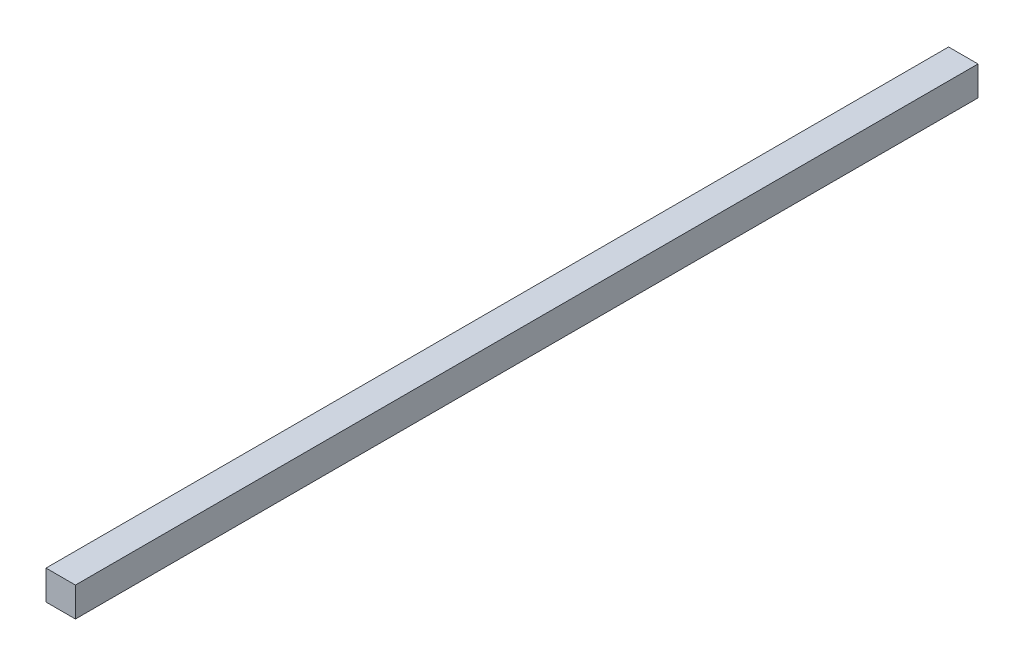
ISO-10303-21;
HEADER;
FILE_DESCRIPTION(('STEP AP214'),'2;1');
FILE_NAME('part.step','',(''),(''),'','','');
FILE_SCHEMA(('AUTOMOTIVE_DESIGN { 1 0 10303 214 1 1 1 1 }'));
ENDSEC;
DATA;
#1=APPLICATION_CONTEXT('core data for automotive mechanical design processes');
#2=APPLICATION_PROTOCOL_DEFINITION('international standard','automotive_design',2000,#1);
#3=PRODUCT_CONTEXT('',#1,'mechanical');
#4=PRODUCT('Part','Part','',(#3));
#5=PRODUCT_RELATED_PRODUCT_CATEGORY('part','',(#4));
#6=PRODUCT_DEFINITION_FORMATION('','',#4);
#7=PRODUCT_DEFINITION_CONTEXT('part definition',#1,'design');
#8=PRODUCT_DEFINITION('design','',#6,#7);
#9=PRODUCT_DEFINITION_SHAPE('','',#8);
#10=(LENGTH_UNIT() NAMED_UNIT(*) SI_UNIT(.MILLI.,.METRE.));
#11=(NAMED_UNIT(*) PLANE_ANGLE_UNIT() SI_UNIT($,.RADIAN.));
#12=(NAMED_UNIT(*) SI_UNIT($,.STERADIAN.) SOLID_ANGLE_UNIT());
#13=UNCERTAINTY_MEASURE_WITH_UNIT(LENGTH_MEASURE(1.E-05),#10,'distance_accuracy_value','');
#14=(GEOMETRIC_REPRESENTATION_CONTEXT(3) GLOBAL_UNCERTAINTY_ASSIGNED_CONTEXT((#13)) GLOBAL_UNIT_ASSIGNED_CONTEXT((#10,
#11,#12)) REPRESENTATION_CONTEXT('',''));
#15=CARTESIAN_POINT('',(0.,0.,0.));
#16=DIRECTION('',(0.,0.,1.));
#17=DIRECTION('',(1.,0.,0.));
#18=AXIS2_PLACEMENT_3D('',#15,#16,#17);
#19=CARTESIAN_POINT('',(-18.7889778520894,711.2,1168.4));
#20=DIRECTION('',(1.,0.,0.));
#21=DIRECTION('',(0.,1.,0.));
#22=AXIS2_PLACEMENT_3D('',#19,#20,#21);
#23=PLANE('',#22);
#24=DIRECTION('',(0.,-1.,0.));
#25=VECTOR('',#24,1.);
#26=CARTESIAN_POINT('',(-18.7889778520894,711.2,0.));
#27=LINE('',#26,#25);
#28=CARTESIAN_POINT('',(-18.7889778520894,711.2,0.));
#29=VERTEX_POINT('',#28);
#30=CARTESIAN_POINT('',(-18.7889778520894,673.1,0.));
#31=VERTEX_POINT('',#30);
#32=EDGE_CURVE('E102',#29,#31,#27,.T.);
#33=ORIENTED_EDGE('',*,*,#32,.T.);
#34=DIRECTION('',(0.,0.,-1.));
#35=VECTOR('',#34,1.);
#36=CARTESIAN_POINT('',(-18.7889778520894,673.1,1168.4));
#37=LINE('',#36,#35);
#38=CARTESIAN_POINT('',(-18.7889778520894,673.1,1168.4));
#39=VERTEX_POINT('',#38);
#40=EDGE_CURVE('E11',#39,#31,#37,.T.);
#41=ORIENTED_EDGE('',*,*,#40,.F.);
#42=DIRECTION('',(0.,-1.,0.));
#43=VECTOR('',#42,1.);
#44=CARTESIAN_POINT('',(-18.7889778520894,711.2,1168.4));
#45=LINE('',#44,#43);
#46=CARTESIAN_POINT('',(-18.7889778520894,711.2,1168.4));
#47=VERTEX_POINT('',#46);
#48=EDGE_CURVE('E90',#47,#39,#45,.T.);
#49=ORIENTED_EDGE('',*,*,#48,.F.);
#50=DIRECTION('',(0.,0.,-1.));
#51=VECTOR('',#50,1.);
#52=CARTESIAN_POINT('',(-18.7889778520894,711.2,1168.4));
#53=LINE('',#52,#51);
#54=EDGE_CURVE('E98',#47,#29,#53,.T.);
#55=ORIENTED_EDGE('',*,*,#54,.T.);
#56=EDGE_LOOP('',(#33,#41,#49,#55));
#57=FACE_BOUND('',#56,.T.);
#58=ADVANCED_FACE('F39',(#57),#23,.F.);
#59=CARTESIAN_POINT('',(-18.7889778520894,673.1,1168.4));
#60=DIRECTION('',(0.,1.,0.));
#61=DIRECTION('',(0.,0.,1.));
#62=AXIS2_PLACEMENT_3D('',#59,#60,#61);
#63=PLANE('',#62);
#64=DIRECTION('',(1.,0.,0.));
#65=VECTOR('',#64,1.);
#66=CARTESIAN_POINT('',(-18.7889778520894,673.1,0.));
#67=LINE('',#66,#65);
#68=CARTESIAN_POINT('',(19.3110221479106,673.1,0.));
#69=VERTEX_POINT('',#68);
#70=EDGE_CURVE('E94',#31,#69,#67,.T.);
#71=ORIENTED_EDGE('',*,*,#70,.T.);
#72=DIRECTION('',(0.,0.,-1.));
#73=VECTOR('',#72,1.);
#74=CARTESIAN_POINT('',(19.3110221479106,673.1,1168.4));
#75=LINE('',#74,#73);
#76=CARTESIAN_POINT('',(19.3110221479106,673.1,1168.4));
#77=VERTEX_POINT('',#76);
#78=EDGE_CURVE('E47',#77,#69,#75,.T.);
#79=ORIENTED_EDGE('',*,*,#78,.F.);
#80=DIRECTION('',(1.,0.,0.));
#81=VECTOR('',#80,1.);
#82=CARTESIAN_POINT('',(-18.7889778520894,673.1,1168.4));
#83=LINE('',#82,#81);
#84=EDGE_CURVE('E85',#39,#77,#83,.T.);
#85=ORIENTED_EDGE('',*,*,#84,.F.);
#86=ORIENTED_EDGE('',*,*,#40,.T.);
#87=EDGE_LOOP('',(#71,#79,#85,#86));
#88=FACE_BOUND('',#87,.T.);
#89=ADVANCED_FACE('F93',(#88),#63,.F.);
#90=CARTESIAN_POINT('',(19.3110221479106,711.2,1168.4));
#91=DIRECTION('',(-1.,0.,0.));
#92=DIRECTION('',(0.,-1.,0.));
#93=AXIS2_PLACEMENT_3D('',#90,#91,#92);
#94=PLANE('',#93);
#95=DIRECTION('',(0.,1.,0.));
#96=VECTOR('',#95,1.);
#97=CARTESIAN_POINT('',(19.3110221479106,711.2,0.));
#98=LINE('',#97,#96);
#99=CARTESIAN_POINT('',(19.3110221479106,711.2,0.));
#100=VERTEX_POINT('',#99);
#101=EDGE_CURVE('E72',#69,#100,#98,.T.);
#102=ORIENTED_EDGE('',*,*,#101,.T.);
#103=DIRECTION('',(0.,0.,-1.));
#104=VECTOR('',#103,1.);
#105=CARTESIAN_POINT('',(19.3110221479106,711.2,1168.4));
#106=LINE('',#105,#104);
#107=CARTESIAN_POINT('',(19.3110221479106,711.2,1168.4));
#108=VERTEX_POINT('',#107);
#109=EDGE_CURVE('E95',#108,#100,#106,.T.);
#110=ORIENTED_EDGE('',*,*,#109,.F.);
#111=DIRECTION('',(0.,1.,0.));
#112=VECTOR('',#111,1.);
#113=CARTESIAN_POINT('',(19.3110221479106,711.2,1168.4));
#114=LINE('',#113,#112);
#115=EDGE_CURVE('E88',#77,#108,#114,.T.);
#116=ORIENTED_EDGE('',*,*,#115,.F.);
#117=ORIENTED_EDGE('',*,*,#78,.T.);
#118=EDGE_LOOP('',(#102,#110,#116,#117));
#119=FACE_BOUND('',#118,.T.);
#120=ADVANCED_FACE('F96',(#119),#94,.F.);
#121=CARTESIAN_POINT('',(-18.7889778520894,711.2,1168.4));
#122=DIRECTION('',(0.,-1.,0.));
#123=DIRECTION('',(0.,0.,-1.));
#124=AXIS2_PLACEMENT_3D('',#121,#122,#123);
#125=PLANE('',#124);
#126=DIRECTION('',(-1.,0.,0.));
#127=VECTOR('',#126,1.);
#128=CARTESIAN_POINT('',(-18.7889778520894,711.2,0.));
#129=LINE('',#128,#127);
#130=EDGE_CURVE('E78',#100,#29,#129,.T.);
#131=ORIENTED_EDGE('',*,*,#130,.T.);
#132=ORIENTED_EDGE('',*,*,#54,.F.);
#133=DIRECTION('',(-1.,0.,0.));
#134=VECTOR('',#133,1.);
#135=CARTESIAN_POINT('',(-18.7889778520894,711.2,1168.4));
#136=LINE('',#135,#134);
#137=EDGE_CURVE('E55',#108,#47,#136,.T.);
#138=ORIENTED_EDGE('',*,*,#137,.F.);
#139=ORIENTED_EDGE('',*,*,#109,.T.);
#140=EDGE_LOOP('',(#131,#132,#138,#139));
#141=FACE_BOUND('',#140,.T.);
#142=ADVANCED_FACE('F109',(#141),#125,.F.);
#143=CARTESIAN_POINT('',(0.,0.,1168.4));
#144=DIRECTION('',(0.,0.,1.));
#145=DIRECTION('',(1.,0.,0.));
#146=AXIS2_PLACEMENT_3D('',#143,#144,#145);
#147=PLANE('',#146);
#148=ORIENTED_EDGE('',*,*,#48,.T.);
#149=ORIENTED_EDGE('',*,*,#84,.T.);
#150=ORIENTED_EDGE('',*,*,#115,.T.);
#151=ORIENTED_EDGE('',*,*,#137,.T.);
#152=EDGE_LOOP('',(#148,#149,#150,#151));
#153=FACE_BOUND('',#152,.T.);
#154=ADVANCED_FACE('F86',(#153),#147,.T.);
#155=CARTESIAN_POINT('',(0.,0.,0.));
#156=DIRECTION('',(0.,0.,1.));
#157=DIRECTION('',(1.,0.,0.));
#158=AXIS2_PLACEMENT_3D('',#155,#156,#157);
#159=PLANE('',#158);
#160=ORIENTED_EDGE('',*,*,#32,.F.);
#161=ORIENTED_EDGE('',*,*,#130,.F.);
#162=ORIENTED_EDGE('',*,*,#101,.F.);
#163=ORIENTED_EDGE('',*,*,#70,.F.);
#164=EDGE_LOOP('',(#160,#161,#162,#163));
#165=FACE_BOUND('',#164,.T.);
#166=ADVANCED_FACE('F112',(#165),#159,.F.);
#167=CLOSED_SHELL('',(#58,#89,#120,#142,#154,#166));
#168=MANIFOLD_SOLID_BREP('B2',#167);
#169=ADVANCED_BREP_SHAPE_REPRESENTATION('',(#18,#168),#14);
#170=SHAPE_DEFINITION_REPRESENTATION(#9,#169);
ENDSEC;
END-ISO-10303-21;
